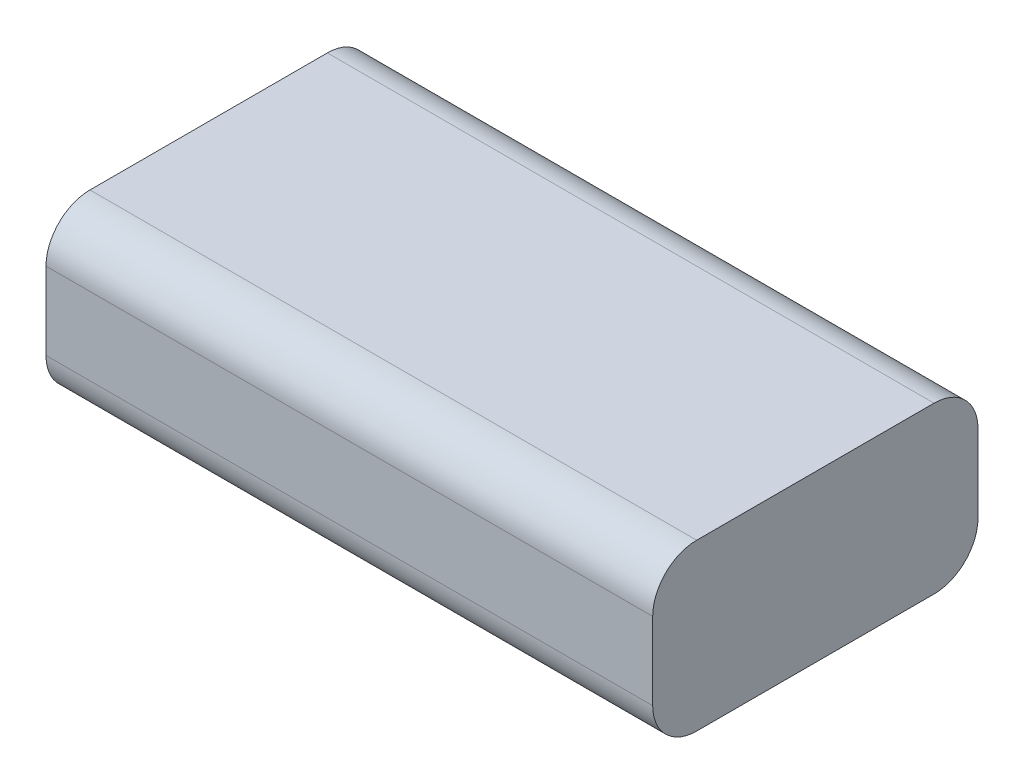
ISO-10303-21;
HEADER;
FILE_DESCRIPTION(('STEP AP214'),'2;1');
FILE_NAME('part.step','',(''),(''),'','','');
FILE_SCHEMA(('AUTOMOTIVE_DESIGN { 1 0 10303 214 1 1 1 1 }'));
ENDSEC;
DATA;
#1=APPLICATION_CONTEXT('core data for automotive mechanical design processes');
#2=APPLICATION_PROTOCOL_DEFINITION('international standard','automotive_design',2000,#1);
#3=PRODUCT_CONTEXT('',#1,'mechanical');
#4=PRODUCT('Part','Part','',(#3));
#5=PRODUCT_RELATED_PRODUCT_CATEGORY('part','',(#4));
#6=PRODUCT_DEFINITION_FORMATION('','',#4);
#7=PRODUCT_DEFINITION_CONTEXT('part definition',#1,'design');
#8=PRODUCT_DEFINITION('design','',#6,#7);
#9=PRODUCT_DEFINITION_SHAPE('','',#8);
#10=(LENGTH_UNIT() NAMED_UNIT(*) SI_UNIT(.MILLI.,.METRE.));
#11=(NAMED_UNIT(*) PLANE_ANGLE_UNIT() SI_UNIT($,.RADIAN.));
#12=(NAMED_UNIT(*) SI_UNIT($,.STERADIAN.) SOLID_ANGLE_UNIT());
#13=UNCERTAINTY_MEASURE_WITH_UNIT(LENGTH_MEASURE(1.E-05),#10,'distance_accuracy_value','');
#14=(GEOMETRIC_REPRESENTATION_CONTEXT(3) GLOBAL_UNCERTAINTY_ASSIGNED_CONTEXT((#13)) GLOBAL_UNIT_ASSIGNED_CONTEXT((#10,
#11,#12)) REPRESENTATION_CONTEXT('',''));
#15=CARTESIAN_POINT('',(0.,0.,0.));
#16=DIRECTION('',(0.,0.,1.));
#17=DIRECTION('',(1.,0.,0.));
#18=AXIS2_PLACEMENT_3D('',#15,#16,#17);
#19=CARTESIAN_POINT('',(34.5,18.8,18.5));
#20=DIRECTION('',(-1.,0.,0.));
#21=DIRECTION('',(0.,0.,1.));
#22=AXIS2_PLACEMENT_3D('',#19,#20,#21);
#23=PLANE('',#22);
#24=DIRECTION('',(0.,0.,-1.));
#25=VECTOR('',#24,1.);
#26=CARTESIAN_POINT('',(34.5,0.,18.5));
#27=LINE('',#26,#25);
#28=CARTESIAN_POINT('',(34.5,0.,13.5));
#29=VERTEX_POINT('',#28);
#30=CARTESIAN_POINT('',(34.5,0.,-13.5));
#31=VERTEX_POINT('',#30);
#32=EDGE_CURVE('E165',#29,#31,#27,.T.);
#33=ORIENTED_EDGE('',*,*,#32,.T.);
#34=CARTESIAN_POINT('',(34.5,5.,-13.5));
#35=DIRECTION('',(-1.,0.,0.));
#36=DIRECTION('',(0.,0.,1.));
#37=AXIS2_PLACEMENT_3D('',#34,#35,#36);
#38=CIRCLE('',#37,5.);
#39=CARTESIAN_POINT('',(34.5,5.,-18.5));
#40=VERTEX_POINT('',#39);
#41=EDGE_CURVE('E150',#31,#40,#38,.F.);
#42=ORIENTED_EDGE('',*,*,#41,.T.);
#43=DIRECTION('',(0.,-1.,0.));
#44=VECTOR('',#43,1.);
#45=CARTESIAN_POINT('',(34.5,18.8,-18.5));
#46=LINE('',#45,#44);
#47=CARTESIAN_POINT('',(34.5,13.8,-18.5));
#48=VERTEX_POINT('',#47);
#49=EDGE_CURVE('E129',#48,#40,#46,.T.);
#50=ORIENTED_EDGE('',*,*,#49,.F.);
#51=CARTESIAN_POINT('',(34.5,13.8,-13.5));
#52=DIRECTION('',(-1.,0.,0.));
#53=DIRECTION('',(0.,0.,1.));
#54=AXIS2_PLACEMENT_3D('',#51,#52,#53);
#55=CIRCLE('',#54,5.);
#56=CARTESIAN_POINT('',(34.5,18.8,-13.5));
#57=VERTEX_POINT('',#56);
#58=EDGE_CURVE('E133',#48,#57,#55,.F.);
#59=ORIENTED_EDGE('',*,*,#58,.T.);
#60=DIRECTION('',(0.,0.,-1.));
#61=VECTOR('',#60,1.);
#62=CARTESIAN_POINT('',(34.5,18.8,18.5));
#63=LINE('',#62,#61);
#64=CARTESIAN_POINT('',(34.5,18.8,13.5));
#65=VERTEX_POINT('',#64);
#66=EDGE_CURVE('E159',#65,#57,#63,.T.);
#67=ORIENTED_EDGE('',*,*,#66,.F.);
#68=CARTESIAN_POINT('',(34.5,13.8,13.5));
#69=DIRECTION('',(-1.,0.,0.));
#70=DIRECTION('',(0.,0.,1.));
#71=AXIS2_PLACEMENT_3D('',#68,#69,#70);
#72=CIRCLE('',#71,5.);
#73=CARTESIAN_POINT('',(34.5,13.8,18.5));
#74=VERTEX_POINT('',#73);
#75=EDGE_CURVE('E65',#65,#74,#72,.F.);
#76=ORIENTED_EDGE('',*,*,#75,.T.);
#77=DIRECTION('',(0.,-1.,0.));
#78=VECTOR('',#77,1.);
#79=CARTESIAN_POINT('',(34.5,18.8,18.5));
#80=LINE('',#79,#78);
#81=CARTESIAN_POINT('',(34.5,5.,18.5));
#82=VERTEX_POINT('',#81);
#83=EDGE_CURVE('E162',#74,#82,#80,.T.);
#84=ORIENTED_EDGE('',*,*,#83,.T.);
#85=CARTESIAN_POINT('',(34.5,5.,13.5));
#86=DIRECTION('',(-1.,0.,0.));
#87=DIRECTION('',(0.,0.,1.));
#88=AXIS2_PLACEMENT_3D('',#85,#86,#87);
#89=CIRCLE('',#88,5.);
#90=EDGE_CURVE('E57',#82,#29,#89,.F.);
#91=ORIENTED_EDGE('',*,*,#90,.T.);
#92=EDGE_LOOP('',(#33,#42,#50,#59,#67,#76,#84,#91));
#93=FACE_BOUND('',#92,.T.);
#94=ADVANCED_FACE('F42',(#93),#23,.F.);
#95=CARTESIAN_POINT('',(-34.5,18.8,-18.5));
#96=DIRECTION('',(0.,0.,1.));
#97=DIRECTION('',(1.,0.,0.));
#98=AXIS2_PLACEMENT_3D('',#95,#96,#97);
#99=PLANE('',#98);
#100=ORIENTED_EDGE('',*,*,#49,.T.);
#101=DIRECTION('',(-1.,0.,0.));
#102=VECTOR('',#101,1.);
#103=CARTESIAN_POINT('',(-34.5,5.,-18.5));
#104=LINE('',#103,#102);
#105=CARTESIAN_POINT('',(-34.5,5.,-18.5));
#106=VERTEX_POINT('',#105);
#107=EDGE_CURVE('E120',#40,#106,#104,.T.);
#108=ORIENTED_EDGE('',*,*,#107,.T.);
#109=DIRECTION('',(0.,-1.,0.));
#110=VECTOR('',#109,1.);
#111=CARTESIAN_POINT('',(-34.5,18.8,-18.5));
#112=LINE('',#111,#110);
#113=CARTESIAN_POINT('',(-34.5,13.8,-18.5));
#114=VERTEX_POINT('',#113);
#115=EDGE_CURVE('E112',#114,#106,#112,.T.);
#116=ORIENTED_EDGE('',*,*,#115,.F.);
#117=DIRECTION('',(-1.,0.,0.));
#118=VECTOR('',#117,1.);
#119=CARTESIAN_POINT('',(-34.5,13.8,-18.5));
#120=LINE('',#119,#118);
#121=EDGE_CURVE('E126',#114,#48,#120,.F.);
#122=ORIENTED_EDGE('',*,*,#121,.T.);
#123=EDGE_LOOP('',(#100,#108,#116,#122));
#124=FACE_BOUND('',#123,.T.);
#125=ADVANCED_FACE('F125',(#124),#99,.F.);
#126=CARTESIAN_POINT('',(-34.5,18.8,18.5));
#127=DIRECTION('',(1.,0.,0.));
#128=DIRECTION('',(0.,0.,-1.));
#129=AXIS2_PLACEMENT_3D('',#126,#127,#128);
#130=PLANE('',#129);
#131=ORIENTED_EDGE('',*,*,#115,.T.);
#132=CARTESIAN_POINT('',(-34.5,5.,-13.5));
#133=DIRECTION('',(1.,0.,0.));
#134=DIRECTION('',(0.,0.,-1.));
#135=AXIS2_PLACEMENT_3D('',#132,#133,#134);
#136=CIRCLE('',#135,5.);
#137=CARTESIAN_POINT('',(-34.5,0.,-13.5));
#138=VERTEX_POINT('',#137);
#139=EDGE_CURVE('E141',#106,#138,#136,.F.);
#140=ORIENTED_EDGE('',*,*,#139,.T.);
#141=DIRECTION('',(0.,0.,1.));
#142=VECTOR('',#141,1.);
#143=CARTESIAN_POINT('',(-34.5,0.,18.5));
#144=LINE('',#143,#142);
#145=CARTESIAN_POINT('',(-34.5,0.,13.5));
#146=VERTEX_POINT('',#145);
#147=EDGE_CURVE('E160',#138,#146,#144,.T.);
#148=ORIENTED_EDGE('',*,*,#147,.T.);
#149=CARTESIAN_POINT('',(-34.5,5.,13.5));
#150=DIRECTION('',(1.,0.,0.));
#151=DIRECTION('',(0.,0.,-1.));
#152=AXIS2_PLACEMENT_3D('',#149,#150,#151);
#153=CIRCLE('',#152,5.);
#154=CARTESIAN_POINT('',(-34.5,5.,18.5));
#155=VERTEX_POINT('',#154);
#156=EDGE_CURVE('E139',#146,#155,#153,.F.);
#157=ORIENTED_EDGE('',*,*,#156,.T.);
#158=DIRECTION('',(0.,-1.,0.));
#159=VECTOR('',#158,1.);
#160=CARTESIAN_POINT('',(-34.5,18.8,18.5));
#161=LINE('',#160,#159);
#162=CARTESIAN_POINT('',(-34.5,13.8,18.5));
#163=VERTEX_POINT('',#162);
#164=EDGE_CURVE('E130',#163,#155,#161,.T.);
#165=ORIENTED_EDGE('',*,*,#164,.F.);
#166=CARTESIAN_POINT('',(-34.5,13.8,13.5));
#167=DIRECTION('',(1.,0.,0.));
#168=DIRECTION('',(0.,0.,-1.));
#169=AXIS2_PLACEMENT_3D('',#166,#167,#168);
#170=CIRCLE('',#169,5.);
#171=CARTESIAN_POINT('',(-34.5,18.8,13.5));
#172=VERTEX_POINT('',#171);
#173=EDGE_CURVE('E119',#163,#172,#170,.F.);
#174=ORIENTED_EDGE('',*,*,#173,.T.);
#175=DIRECTION('',(0.,0.,1.));
#176=VECTOR('',#175,1.);
#177=CARTESIAN_POINT('',(-34.5,18.8,18.5));
#178=LINE('',#177,#176);
#179=CARTESIAN_POINT('',(-34.5,18.8,-13.5));
#180=VERTEX_POINT('',#179);
#181=EDGE_CURVE('E114',#180,#172,#178,.T.);
#182=ORIENTED_EDGE('',*,*,#181,.F.);
#183=CARTESIAN_POINT('',(-34.5,13.8,-13.5));
#184=DIRECTION('',(1.,0.,0.));
#185=DIRECTION('',(0.,0.,-1.));
#186=AXIS2_PLACEMENT_3D('',#183,#184,#185);
#187=CIRCLE('',#186,5.);
#188=EDGE_CURVE('E109',#180,#114,#187,.F.);
#189=ORIENTED_EDGE('',*,*,#188,.T.);
#190=EDGE_LOOP('',(#131,#140,#148,#157,#165,#174,#182,#189));
#191=FACE_BOUND('',#190,.T.);
#192=ADVANCED_FACE('F111',(#191),#130,.F.);
#193=CARTESIAN_POINT('',(-34.5,18.8,18.5));
#194=DIRECTION('',(0.,0.,-1.));
#195=DIRECTION('',(-1.,0.,0.));
#196=AXIS2_PLACEMENT_3D('',#193,#194,#195);
#197=PLANE('',#196);
#198=ORIENTED_EDGE('',*,*,#164,.T.);
#199=DIRECTION('',(1.,0.,0.));
#200=VECTOR('',#199,1.);
#201=CARTESIAN_POINT('',(34.5,5.,18.5));
#202=LINE('',#201,#200);
#203=EDGE_CURVE('E154',#155,#82,#202,.T.);
#204=ORIENTED_EDGE('',*,*,#203,.T.);
#205=ORIENTED_EDGE('',*,*,#83,.F.);
#206=DIRECTION('',(1.,0.,0.));
#207=VECTOR('',#206,1.);
#208=CARTESIAN_POINT('',(-34.5,13.8,18.5));
#209=LINE('',#208,#207);
#210=EDGE_CURVE('E152',#74,#163,#209,.F.);
#211=ORIENTED_EDGE('',*,*,#210,.T.);
#212=EDGE_LOOP('',(#198,#204,#205,#211));
#213=FACE_BOUND('',#212,.T.);
#214=ADVANCED_FACE('F174',(#213),#197,.F.);
#215=CARTESIAN_POINT('',(0.,18.8,0.));
#216=DIRECTION('',(0.,-1.,0.));
#217=DIRECTION('',(0.,0.,-1.));
#218=AXIS2_PLACEMENT_3D('',#215,#216,#217);
#219=PLANE('',#218);
#220=ORIENTED_EDGE('',*,*,#181,.T.);
#221=DIRECTION('',(1.,0.,0.));
#222=VECTOR('',#221,1.);
#223=CARTESIAN_POINT('',(0.,18.8,13.5));
#224=LINE('',#223,#222);
#225=EDGE_CURVE('E11',#172,#65,#224,.T.);
#226=ORIENTED_EDGE('',*,*,#225,.T.);
#227=ORIENTED_EDGE('',*,*,#66,.T.);
#228=DIRECTION('',(-1.,0.,0.));
#229=VECTOR('',#228,1.);
#230=CARTESIAN_POINT('',(0.,18.8,-13.5));
#231=LINE('',#230,#229);
#232=EDGE_CURVE('E50',#57,#180,#231,.T.);
#233=ORIENTED_EDGE('',*,*,#232,.T.);
#234=EDGE_LOOP('',(#220,#226,#227,#233));
#235=FACE_BOUND('',#234,.T.);
#236=ADVANCED_FACE('F157',(#235),#219,.F.);
#237=CARTESIAN_POINT('',(0.,0.,0.));
#238=DIRECTION('',(0.,-1.,0.));
#239=DIRECTION('',(0.,0.,-1.));
#240=AXIS2_PLACEMENT_3D('',#237,#238,#239);
#241=PLANE('',#240);
#242=ORIENTED_EDGE('',*,*,#147,.F.);
#243=DIRECTION('',(-1.,0.,0.));
#244=VECTOR('',#243,1.);
#245=CARTESIAN_POINT('',(34.5,0.,-13.5));
#246=LINE('',#245,#244);
#247=EDGE_CURVE('E145',#138,#31,#246,.F.);
#248=ORIENTED_EDGE('',*,*,#247,.T.);
#249=ORIENTED_EDGE('',*,*,#32,.F.);
#250=DIRECTION('',(1.,0.,0.));
#251=VECTOR('',#250,1.);
#252=CARTESIAN_POINT('',(-34.5,0.,13.5));
#253=LINE('',#252,#251);
#254=EDGE_CURVE('E143',#29,#146,#253,.F.);
#255=ORIENTED_EDGE('',*,*,#254,.T.);
#256=EDGE_LOOP('',(#242,#248,#249,#255));
#257=FACE_BOUND('',#256,.T.);
#258=ADVANCED_FACE('F182',(#257),#241,.T.);
#259=CARTESIAN_POINT('',(-34.5,5.,-13.5));
#260=DIRECTION('',(1.,0.,0.));
#261=DIRECTION('',(0.,0.,-1.));
#262=AXIS2_PLACEMENT_3D('',#259,#260,#261);
#263=CYLINDRICAL_SURFACE('',#262,5.);
#264=ORIENTED_EDGE('',*,*,#41,.F.);
#265=ORIENTED_EDGE('',*,*,#247,.F.);
#266=ORIENTED_EDGE('',*,*,#139,.F.);
#267=ORIENTED_EDGE('',*,*,#107,.F.);
#268=EDGE_LOOP('',(#264,#265,#266,#267));
#269=FACE_BOUND('',#268,.T.);
#270=ADVANCED_FACE('F186',(#269),#263,.T.);
#271=CARTESIAN_POINT('',(-34.5,5.,13.5));
#272=DIRECTION('',(-1.,0.,0.));
#273=DIRECTION('',(0.,0.,1.));
#274=AXIS2_PLACEMENT_3D('',#271,#272,#273);
#275=CYLINDRICAL_SURFACE('',#274,5.);
#276=ORIENTED_EDGE('',*,*,#156,.F.);
#277=ORIENTED_EDGE('',*,*,#254,.F.);
#278=ORIENTED_EDGE('',*,*,#90,.F.);
#279=ORIENTED_EDGE('',*,*,#203,.F.);
#280=EDGE_LOOP('',(#276,#277,#278,#279));
#281=FACE_BOUND('',#280,.T.);
#282=ADVANCED_FACE('F178',(#281),#275,.T.);
#283=CARTESIAN_POINT('',(0.,13.8,13.5));
#284=DIRECTION('',(1.,0.,0.));
#285=DIRECTION('',(0.,0.,-1.));
#286=AXIS2_PLACEMENT_3D('',#283,#284,#285);
#287=CYLINDRICAL_SURFACE('',#286,5.);
#288=ORIENTED_EDGE('',*,*,#173,.F.);
#289=ORIENTED_EDGE('',*,*,#210,.F.);
#290=ORIENTED_EDGE('',*,*,#75,.F.);
#291=ORIENTED_EDGE('',*,*,#225,.F.);
#292=EDGE_LOOP('',(#288,#289,#290,#291));
#293=FACE_BOUND('',#292,.T.);
#294=ADVANCED_FACE('F188',(#293),#287,.T.);
#295=CARTESIAN_POINT('',(0.,13.8,-13.5));
#296=DIRECTION('',(-1.,0.,0.));
#297=DIRECTION('',(0.,0.,1.));
#298=AXIS2_PLACEMENT_3D('',#295,#296,#297);
#299=CYLINDRICAL_SURFACE('',#298,5.);
#300=ORIENTED_EDGE('',*,*,#58,.F.);
#301=ORIENTED_EDGE('',*,*,#121,.F.);
#302=ORIENTED_EDGE('',*,*,#188,.F.);
#303=ORIENTED_EDGE('',*,*,#232,.F.);
#304=EDGE_LOOP('',(#300,#301,#302,#303));
#305=FACE_BOUND('',#304,.T.);
#306=ADVANCED_FACE('F44',(#305),#299,.T.);
#307=CLOSED_SHELL('',(#94,#125,#192,#214,#236,#258,#270,#282,#294,#306));
#308=MANIFOLD_SOLID_BREP('B2',#307);
#309=ADVANCED_BREP_SHAPE_REPRESENTATION('',(#18,#308),#14);
#310=SHAPE_DEFINITION_REPRESENTATION(#9,#309);
ENDSEC;
END-ISO-10303-21;
